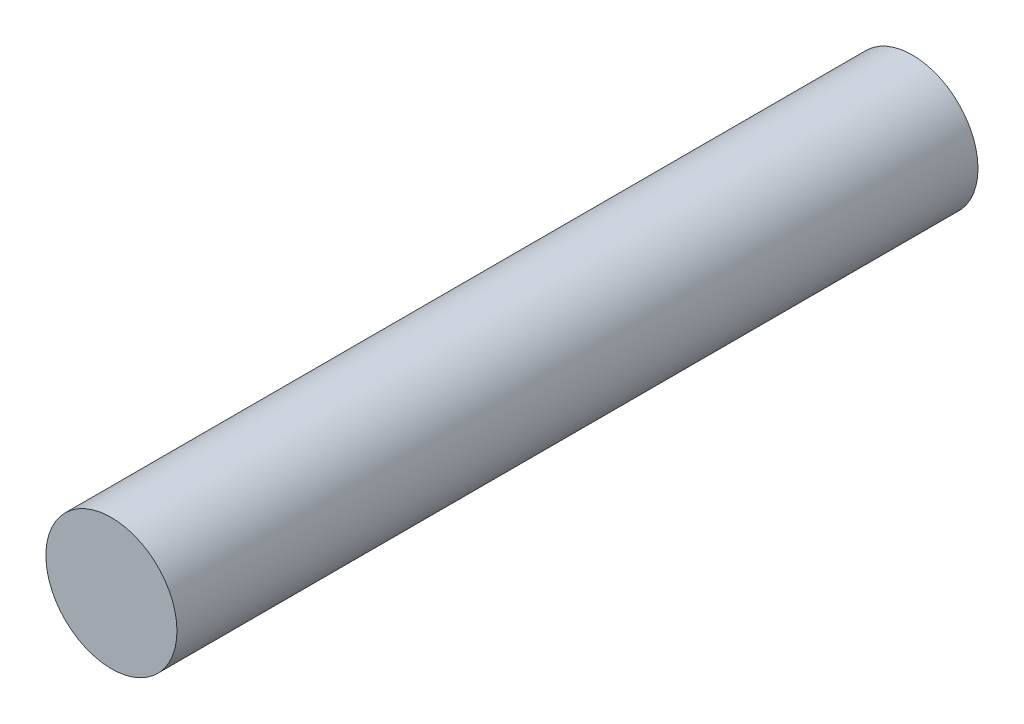
ISO-10303-21;
HEADER;
FILE_DESCRIPTION(('STEP AP214'),'2;1');
FILE_NAME('part.step','',(''),(''),'','','');
FILE_SCHEMA(('AUTOMOTIVE_DESIGN { 1 0 10303 214 1 1 1 1 }'));
ENDSEC;
DATA;
#1=APPLICATION_CONTEXT('core data for automotive mechanical design processes');
#2=APPLICATION_PROTOCOL_DEFINITION('international standard','automotive_design',2000,#1);
#3=PRODUCT_CONTEXT('',#1,'mechanical');
#4=PRODUCT('Part','Part','',(#3));
#5=PRODUCT_RELATED_PRODUCT_CATEGORY('part','',(#4));
#6=PRODUCT_DEFINITION_FORMATION('','',#4);
#7=PRODUCT_DEFINITION_CONTEXT('part definition',#1,'design');
#8=PRODUCT_DEFINITION('design','',#6,#7);
#9=PRODUCT_DEFINITION_SHAPE('','',#8);
#10=(LENGTH_UNIT() NAMED_UNIT(*) SI_UNIT(.MILLI.,.METRE.));
#11=(NAMED_UNIT(*) PLANE_ANGLE_UNIT() SI_UNIT($,.RADIAN.));
#12=(NAMED_UNIT(*) SI_UNIT($,.STERADIAN.) SOLID_ANGLE_UNIT());
#13=UNCERTAINTY_MEASURE_WITH_UNIT(LENGTH_MEASURE(1.E-05),#10,'distance_accuracy_value','');
#14=(GEOMETRIC_REPRESENTATION_CONTEXT(3) GLOBAL_UNCERTAINTY_ASSIGNED_CONTEXT((#13)) GLOBAL_UNIT_ASSIGNED_CONTEXT((#10,
#11,#12)) REPRESENTATION_CONTEXT('',''));
#15=CARTESIAN_POINT('',(0.,0.,0.));
#16=DIRECTION('',(0.,0.,1.));
#17=DIRECTION('',(1.,0.,0.));
#18=AXIS2_PLACEMENT_3D('',#15,#16,#17);
#19=CARTESIAN_POINT('',(53.9,29.0000000000001,1.));
#20=DIRECTION('',(0.,0.,-1.));
#21=DIRECTION('',(-1.,0.,0.));
#22=AXIS2_PLACEMENT_3D('',#19,#20,#21);
#23=PLANE('',#22);
#24=CARTESIAN_POINT('',(53.9,29.0000000000001,1.));
#25=DIRECTION('',(0.,0.,1.));
#26=DIRECTION('',(1.,0.,0.));
#27=AXIS2_PLACEMENT_3D('',#24,#25,#26);
#28=CIRCLE('',#27,0.45);
#29=CARTESIAN_POINT('',(54.35,29.0000000000001,1.));
#30=VERTEX_POINT('',#29);
#31=EDGE_CURVE('E18',#30,#30,#28,.T.);
#32=ORIENTED_EDGE('',*,*,#31,.F.);
#33=EDGE_LOOP('',(#32));
#34=FACE_BOUND('',#33,.T.);
#35=ADVANCED_FACE('F15',(#34),#23,.T.);
#36=CARTESIAN_POINT('',(53.9,29.0000000000001,6.5));
#37=DIRECTION('',(0.,0.,-1.));
#38=DIRECTION('',(-1.,0.,0.));
#39=AXIS2_PLACEMENT_3D('',#36,#37,#38);
#40=PLANE('',#39);
#41=CARTESIAN_POINT('',(53.9,29.0000000000001,6.5));
#42=DIRECTION('',(0.,0.,1.));
#43=DIRECTION('',(1.,0.,0.));
#44=AXIS2_PLACEMENT_3D('',#41,#42,#43);
#45=CIRCLE('',#44,0.45);
#46=CARTESIAN_POINT('',(54.35,29.0000000000001,6.5));
#47=VERTEX_POINT('',#46);
#48=EDGE_CURVE('E10',#47,#47,#45,.F.);
#49=ORIENTED_EDGE('',*,*,#48,.F.);
#50=EDGE_LOOP('',(#49));
#51=FACE_BOUND('',#50,.T.);
#52=ADVANCED_FACE('F30',(#51),#40,.F.);
#53=CARTESIAN_POINT('',(53.9,29.0000000000001,1.));
#54=DIRECTION('',(0.,0.,1.));
#55=DIRECTION('',(1.,0.,0.));
#56=AXIS2_PLACEMENT_3D('',#53,#54,#55);
#57=CYLINDRICAL_SURFACE('',#56,0.45);
#58=ORIENTED_EDGE('',*,*,#48,.T.);
#59=EDGE_LOOP('',(#58));
#60=FACE_BOUND('',#59,.T.);
#61=ORIENTED_EDGE('',*,*,#31,.T.);
#62=EDGE_LOOP('',(#61));
#63=FACE_BOUND('',#62,.T.);
#64=ADVANCED_FACE('F27',(#60,#63),#57,.T.);
#65=CLOSED_SHELL('',(#35,#52,#64));
#66=MANIFOLD_SOLID_BREP('B1',#65);
#67=ADVANCED_BREP_SHAPE_REPRESENTATION('',(#18,#66),#14);
#68=SHAPE_DEFINITION_REPRESENTATION(#9,#67);
ENDSEC;
END-ISO-10303-21;
